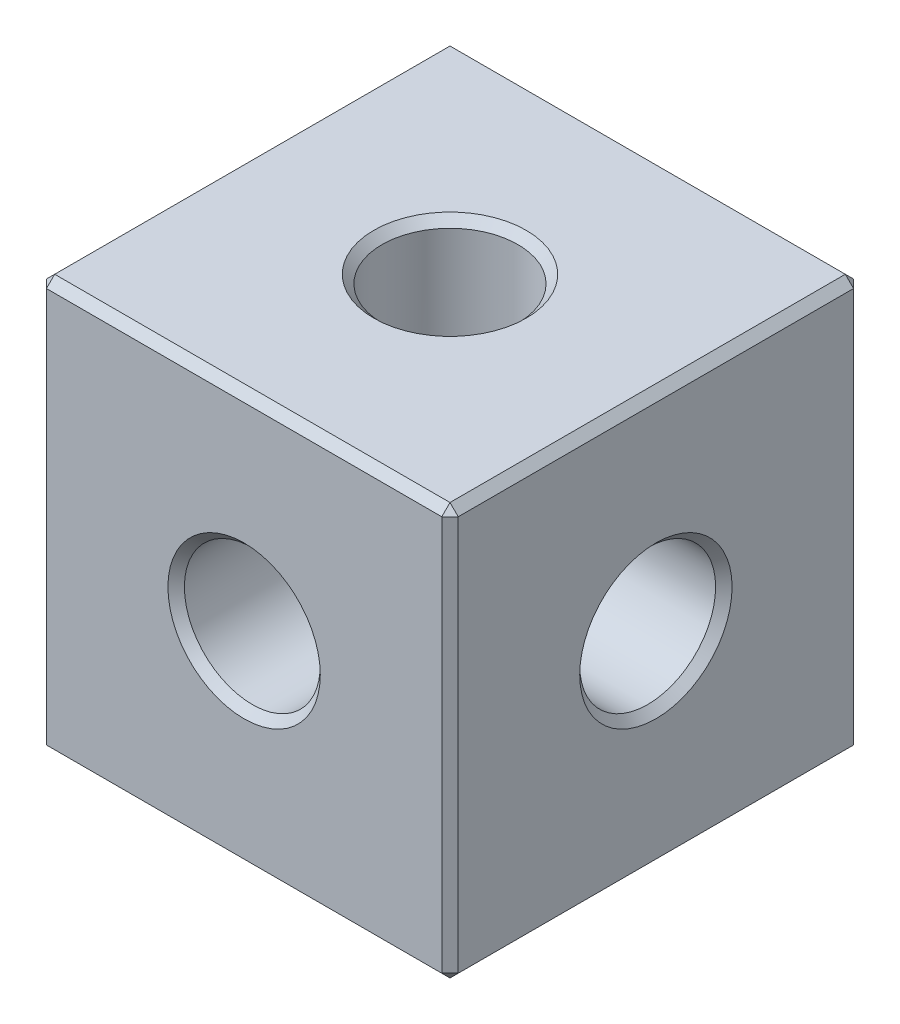
ISO-10303-21;
HEADER;
FILE_DESCRIPTION(('STEP AP214'),'2;1');
FILE_NAME('part.step','',(''),(''),'','','');
FILE_SCHEMA(('AUTOMOTIVE_DESIGN { 1 0 10303 214 1 1 1 1 }'));
ENDSEC;
DATA;
#1=APPLICATION_CONTEXT('core data for automotive mechanical design processes');
#2=APPLICATION_PROTOCOL_DEFINITION('international standard','automotive_design',2000,#1);
#3=PRODUCT_CONTEXT('',#1,'mechanical');
#4=PRODUCT('Part','Part','',(#3));
#5=PRODUCT_RELATED_PRODUCT_CATEGORY('part','',(#4));
#6=PRODUCT_DEFINITION_FORMATION('','',#4);
#7=PRODUCT_DEFINITION_CONTEXT('part definition',#1,'design');
#8=PRODUCT_DEFINITION('design','',#6,#7);
#9=PRODUCT_DEFINITION_SHAPE('','',#8);
#10=(LENGTH_UNIT() NAMED_UNIT(*) SI_UNIT(.MILLI.,.METRE.));
#11=(NAMED_UNIT(*) PLANE_ANGLE_UNIT() SI_UNIT($,.RADIAN.));
#12=(NAMED_UNIT(*) SI_UNIT($,.STERADIAN.) SOLID_ANGLE_UNIT());
#13=UNCERTAINTY_MEASURE_WITH_UNIT(LENGTH_MEASURE(1.E-05),#10,'distance_accuracy_value','');
#14=(GEOMETRIC_REPRESENTATION_CONTEXT(3) GLOBAL_UNCERTAINTY_ASSIGNED_CONTEXT((#13)) GLOBAL_UNIT_ASSIGNED_CONTEXT((#10,
#11,#12)) REPRESENTATION_CONTEXT('',''));
#15=CARTESIAN_POINT('',(0.,0.,0.));
#16=DIRECTION('',(0.,0.,1.));
#17=DIRECTION('',(1.,0.,0.));
#18=AXIS2_PLACEMENT_3D('',#15,#16,#17);
#19=CARTESIAN_POINT('',(0.,0.,5.));
#20=DIRECTION('',(0.,0.,1.));
#21=DIRECTION('',(1.,0.,0.));
#22=AXIS2_PLACEMENT_3D('',#19,#20,#21);
#23=CYLINDRICAL_SURFACE('',#22,1.65);
#24=CARTESIAN_POINT('',(0.,0.,4.8));
#25=DIRECTION('',(0.,0.,-1.));
#26=DIRECTION('',(-1.,0.,0.));
#27=AXIS2_PLACEMENT_3D('',#24,#25,#26);
#28=CIRCLE('',#27,1.65);
#29=CARTESIAN_POINT('',(-1.65,0.,4.8));
#30=VERTEX_POINT('',#29);
#31=EDGE_CURVE('E256',#30,#30,#28,.F.);
#32=ORIENTED_EDGE('',*,*,#31,.T.);
#33=EDGE_LOOP('',(#32));
#34=FACE_BOUND('',#33,.T.);
#35=CARTESIAN_POINT('',(0.,0.,0.));
#36=DIRECTION('',(0.,0.707106781186547,0.707106781186547));
#37=DIRECTION('',(0.,-0.707106781186547,0.707106781186547));
#38=AXIS2_PLACEMENT_3D('',#35,#36,#37);
#39=ELLIPSE('',#38,2.3334523779156,1.65);
#40=CARTESIAN_POINT('',(1.1667261889578,-1.1667261889578,1.1667261889578));
#41=VERTEX_POINT('',#40);
#42=CARTESIAN_POINT('',(-1.1667261889578,-1.1667261889578,1.1667261889578));
#43=VERTEX_POINT('',#42);
#44=EDGE_CURVE('E175',#41,#43,#39,.F.);
#45=ORIENTED_EDGE('',*,*,#44,.T.);
#46=CARTESIAN_POINT('',(0.,0.,0.));
#47=DIRECTION('',(0.707106781186548,0.,0.707106781186547));
#48=DIRECTION('',(-0.707106781186547,0.,0.707106781186547));
#49=AXIS2_PLACEMENT_3D('',#46,#47,#48);
#50=ELLIPSE('',#49,2.3334523779156,1.65);
#51=CARTESIAN_POINT('',(-1.1667261889578,1.1667261889578,1.1667261889578));
#52=VERTEX_POINT('',#51);
#53=EDGE_CURVE('E838',#43,#52,#50,.F.);
#54=ORIENTED_EDGE('',*,*,#53,.T.);
#55=CARTESIAN_POINT('',(0.,0.,0.));
#56=DIRECTION('',(0.,-0.707106781186547,0.707106781186547));
#57=DIRECTION('',(0.,0.707106781186547,0.707106781186547));
#58=AXIS2_PLACEMENT_3D('',#55,#56,#57);
#59=ELLIPSE('',#58,2.3334523779156,1.65);
#60=CARTESIAN_POINT('',(1.1667261889578,1.1667261889578,1.1667261889578));
#61=VERTEX_POINT('',#60);
#62=EDGE_CURVE('E191',#52,#61,#59,.F.);
#63=ORIENTED_EDGE('',*,*,#62,.T.);
#64=CARTESIAN_POINT('',(0.,0.,0.));
#65=DIRECTION('',(-0.707106781186547,0.,0.707106781186547));
#66=DIRECTION('',(0.707106781186548,0.,0.707106781186547));
#67=AXIS2_PLACEMENT_3D('',#64,#65,#66);
#68=ELLIPSE('',#67,2.3334523779156,1.65);
#69=EDGE_CURVE('E169',#61,#41,#68,.F.);
#70=ORIENTED_EDGE('',*,*,#69,.T.);
#71=EDGE_LOOP('',(#45,#54,#63,#70));
#72=FACE_BOUND('',#71,.T.);
#73=ADVANCED_FACE('F49',(#34,#72),#23,.F.);
#74=CARTESIAN_POINT('',(5.,5.,-5.));
#75=DIRECTION('',(-1.,0.,0.));
#76=DIRECTION('',(0.,0.,1.));
#77=AXIS2_PLACEMENT_3D('',#74,#75,#76);
#78=PLANE('',#77);
#79=CARTESIAN_POINT('',(5.,0.,0.));
#80=DIRECTION('',(-1.,0.,0.));
#81=DIRECTION('',(0.,0.,1.));
#82=AXIS2_PLACEMENT_3D('',#79,#80,#81);
#83=CIRCLE('',#82,1.84999999999999);
#84=CARTESIAN_POINT('',(5.,0.,1.84999999999999));
#85=VERTEX_POINT('',#84);
#86=EDGE_CURVE('E253',#85,#85,#83,.T.);
#87=ORIENTED_EDGE('',*,*,#86,.T.);
#88=EDGE_LOOP('',(#87));
#89=FACE_BOUND('',#88,.T.);
#90=DIRECTION('',(0.,0.,-1.));
#91=VECTOR('',#90,1.);
#92=CARTESIAN_POINT('',(5.,-4.8,-5.));
#93=LINE('',#92,#91);
#94=CARTESIAN_POINT('',(5.,-4.8,4.8));
#95=VERTEX_POINT('',#94);
#96=CARTESIAN_POINT('',(5.,-4.8,-4.8));
#97=VERTEX_POINT('',#96);
#98=EDGE_CURVE('E248',#95,#97,#93,.T.);
#99=ORIENTED_EDGE('',*,*,#98,.T.);
#100=DIRECTION('',(0.,1.,0.));
#101=VECTOR('',#100,1.);
#102=CARTESIAN_POINT('',(5.,5.,-4.8));
#103=LINE('',#102,#101);
#104=CARTESIAN_POINT('',(5.,4.8,-4.8));
#105=VERTEX_POINT('',#104);
#106=EDGE_CURVE('E250',#97,#105,#103,.T.);
#107=ORIENTED_EDGE('',*,*,#106,.T.);
#108=DIRECTION('',(0.,0.,1.));
#109=VECTOR('',#108,1.);
#110=CARTESIAN_POINT('',(5.,4.8,5.));
#111=LINE('',#110,#109);
#112=CARTESIAN_POINT('',(5.,4.8,4.8));
#113=VERTEX_POINT('',#112);
#114=EDGE_CURVE('E244',#105,#113,#111,.T.);
#115=ORIENTED_EDGE('',*,*,#114,.T.);
#116=DIRECTION('',(0.,-1.,0.));
#117=VECTOR('',#116,1.);
#118=CARTESIAN_POINT('',(5.,5.,4.8));
#119=LINE('',#118,#117);
#120=EDGE_CURVE('E246',#113,#95,#119,.T.);
#121=ORIENTED_EDGE('',*,*,#120,.T.);
#122=EDGE_LOOP('',(#99,#107,#115,#121));
#123=FACE_BOUND('',#122,.T.);
#124=ADVANCED_FACE('F357',(#89,#123),#78,.F.);
#125=CARTESIAN_POINT('',(-5.,5.,-5.));
#126=DIRECTION('',(0.,0.,1.));
#127=DIRECTION('',(1.,0.,0.));
#128=AXIS2_PLACEMENT_3D('',#125,#126,#127);
#129=PLANE('',#128);
#130=CARTESIAN_POINT('',(0.,0.,-5.));
#131=DIRECTION('',(0.,0.,1.));
#132=DIRECTION('',(1.,0.,0.));
#133=AXIS2_PLACEMENT_3D('',#130,#131,#132);
#134=CIRCLE('',#133,1.85);
#135=CARTESIAN_POINT('',(1.85,0.,-5.));
#136=VERTEX_POINT('',#135);
#137=EDGE_CURVE('E235',#136,#136,#134,.T.);
#138=ORIENTED_EDGE('',*,*,#137,.T.);
#139=EDGE_LOOP('',(#138));
#140=FACE_BOUND('',#139,.T.);
#141=DIRECTION('',(-1.,0.,0.));
#142=VECTOR('',#141,1.);
#143=CARTESIAN_POINT('',(-5.,-4.8,-5.));
#144=LINE('',#143,#142);
#145=CARTESIAN_POINT('',(4.8,-4.8,-5.));
#146=VERTEX_POINT('',#145);
#147=CARTESIAN_POINT('',(-4.8,-4.8,-5.));
#148=VERTEX_POINT('',#147);
#149=EDGE_CURVE('E230',#146,#148,#144,.T.);
#150=ORIENTED_EDGE('',*,*,#149,.T.);
#151=DIRECTION('',(0.,1.,0.));
#152=VECTOR('',#151,1.);
#153=CARTESIAN_POINT('',(-4.8,5.,-5.));
#154=LINE('',#153,#152);
#155=CARTESIAN_POINT('',(-4.8,4.8,-5.));
#156=VERTEX_POINT('',#155);
#157=EDGE_CURVE('E232',#148,#156,#154,.T.);
#158=ORIENTED_EDGE('',*,*,#157,.T.);
#159=DIRECTION('',(1.,0.,0.));
#160=VECTOR('',#159,1.);
#161=CARTESIAN_POINT('',(5.,4.8,-5.));
#162=LINE('',#161,#160);
#163=CARTESIAN_POINT('',(4.8,4.8,-5.));
#164=VERTEX_POINT('',#163);
#165=EDGE_CURVE('E226',#156,#164,#162,.T.);
#166=ORIENTED_EDGE('',*,*,#165,.T.);
#167=DIRECTION('',(0.,-1.,0.));
#168=VECTOR('',#167,1.);
#169=CARTESIAN_POINT('',(4.8,5.,-5.));
#170=LINE('',#169,#168);
#171=EDGE_CURVE('E228',#164,#146,#170,.T.);
#172=ORIENTED_EDGE('',*,*,#171,.T.);
#173=EDGE_LOOP('',(#150,#158,#166,#172));
#174=FACE_BOUND('',#173,.T.);
#175=ADVANCED_FACE('F378',(#140,#174),#129,.F.);
#176=CARTESIAN_POINT('',(-5.,5.,-5.));
#177=DIRECTION('',(1.,0.,0.));
#178=DIRECTION('',(0.,0.,-1.));
#179=AXIS2_PLACEMENT_3D('',#176,#177,#178);
#180=PLANE('',#179);
#181=CARTESIAN_POINT('',(-5.,0.,0.));
#182=DIRECTION('',(1.,0.,0.));
#183=DIRECTION('',(0.,0.,-1.));
#184=AXIS2_PLACEMENT_3D('',#181,#182,#183);
#185=CIRCLE('',#184,1.84999999999999);
#186=CARTESIAN_POINT('',(-5.,0.,-1.84999999999999));
#187=VERTEX_POINT('',#186);
#188=EDGE_CURVE('E220',#187,#187,#185,.T.);
#189=ORIENTED_EDGE('',*,*,#188,.T.);
#190=EDGE_LOOP('',(#189));
#191=FACE_BOUND('',#190,.T.);
#192=DIRECTION('',(0.,-1.,0.));
#193=VECTOR('',#192,1.);
#194=CARTESIAN_POINT('',(-5.,5.,-4.8));
#195=LINE('',#194,#193);
#196=CARTESIAN_POINT('',(-5.,4.8,-4.8));
#197=VERTEX_POINT('',#196);
#198=CARTESIAN_POINT('',(-5.,-4.8,-4.8));
#199=VERTEX_POINT('',#198);
#200=EDGE_CURVE('E215',#197,#199,#195,.T.);
#201=ORIENTED_EDGE('',*,*,#200,.T.);
#202=DIRECTION('',(0.,0.,1.));
#203=VECTOR('',#202,1.);
#204=CARTESIAN_POINT('',(-5.,-4.8,-5.));
#205=LINE('',#204,#203);
#206=CARTESIAN_POINT('',(-5.,-4.8,4.8));
#207=VERTEX_POINT('',#206);
#208=EDGE_CURVE('E217',#199,#207,#205,.T.);
#209=ORIENTED_EDGE('',*,*,#208,.T.);
#210=DIRECTION('',(0.,1.,0.));
#211=VECTOR('',#210,1.);
#212=CARTESIAN_POINT('',(-5.,5.,4.8));
#213=LINE('',#212,#211);
#214=CARTESIAN_POINT('',(-5.,4.8,4.8));
#215=VERTEX_POINT('',#214);
#216=EDGE_CURVE('E213',#207,#215,#213,.T.);
#217=ORIENTED_EDGE('',*,*,#216,.T.);
#218=DIRECTION('',(0.,0.,-1.));
#219=VECTOR('',#218,1.);
#220=CARTESIAN_POINT('',(-5.,4.8,-5.));
#221=LINE('',#220,#219);
#222=EDGE_CURVE('E211',#215,#197,#221,.T.);
#223=ORIENTED_EDGE('',*,*,#222,.T.);
#224=EDGE_LOOP('',(#201,#209,#217,#223));
#225=FACE_BOUND('',#224,.T.);
#226=ADVANCED_FACE('F439',(#191,#225),#180,.F.);
#227=CARTESIAN_POINT('',(-5.,5.,5.));
#228=DIRECTION('',(0.,0.,-1.));
#229=DIRECTION('',(-1.,0.,0.));
#230=AXIS2_PLACEMENT_3D('',#227,#228,#229);
#231=PLANE('',#230);
#232=CARTESIAN_POINT('',(0.,0.,5.));
#233=DIRECTION('',(0.,0.,-1.));
#234=DIRECTION('',(-1.,0.,0.));
#235=AXIS2_PLACEMENT_3D('',#232,#233,#234);
#236=CIRCLE('',#235,1.85);
#237=CARTESIAN_POINT('',(-1.85,0.,5.));
#238=VERTEX_POINT('',#237);
#239=EDGE_CURVE('E268',#238,#238,#236,.T.);
#240=ORIENTED_EDGE('',*,*,#239,.T.);
#241=EDGE_LOOP('',(#240));
#242=FACE_BOUND('',#241,.T.);
#243=DIRECTION('',(-1.,0.,0.));
#244=VECTOR('',#243,1.);
#245=CARTESIAN_POINT('',(-5.,4.8,5.));
#246=LINE('',#245,#244);
#247=CARTESIAN_POINT('',(4.8,4.8,5.));
#248=VERTEX_POINT('',#247);
#249=CARTESIAN_POINT('',(-4.8,4.8,5.));
#250=VERTEX_POINT('',#249);
#251=EDGE_CURVE('E259',#248,#250,#246,.T.);
#252=ORIENTED_EDGE('',*,*,#251,.T.);
#253=DIRECTION('',(0.,-1.,0.));
#254=VECTOR('',#253,1.);
#255=CARTESIAN_POINT('',(-4.8,5.,5.));
#256=LINE('',#255,#254);
#257=CARTESIAN_POINT('',(-4.8,-4.8,5.));
#258=VERTEX_POINT('',#257);
#259=EDGE_CURVE('E265',#250,#258,#256,.T.);
#260=ORIENTED_EDGE('',*,*,#259,.T.);
#261=DIRECTION('',(1.,0.,0.));
#262=VECTOR('',#261,1.);
#263=CARTESIAN_POINT('',(-5.,-4.8,5.));
#264=LINE('',#263,#262);
#265=CARTESIAN_POINT('',(4.8,-4.8,5.));
#266=VERTEX_POINT('',#265);
#267=EDGE_CURVE('E263',#258,#266,#264,.T.);
#268=ORIENTED_EDGE('',*,*,#267,.T.);
#269=DIRECTION('',(0.,1.,0.));
#270=VECTOR('',#269,1.);
#271=CARTESIAN_POINT('',(4.8,5.,5.));
#272=LINE('',#271,#270);
#273=EDGE_CURVE('E261',#266,#248,#272,.T.);
#274=ORIENTED_EDGE('',*,*,#273,.T.);
#275=EDGE_LOOP('',(#252,#260,#268,#274));
#276=FACE_BOUND('',#275,.T.);
#277=ADVANCED_FACE('F445',(#242,#276),#231,.F.);
#278=CARTESIAN_POINT('',(0.,5.,0.));
#279=DIRECTION('',(0.,1.,0.));
#280=DIRECTION('',(0.,0.,1.));
#281=AXIS2_PLACEMENT_3D('',#278,#279,#280);
#282=PLANE('',#281);
#283=DIRECTION('',(0.,0.,1.));
#284=VECTOR('',#283,1.);
#285=CARTESIAN_POINT('',(-4.8,5.,5.));
#286=LINE('',#285,#284);
#287=CARTESIAN_POINT('',(-4.80000000000001,5.,-4.8));
#288=VERTEX_POINT('',#287);
#289=CARTESIAN_POINT('',(-4.8,5.,4.8));
#290=VERTEX_POINT('',#289);
#291=EDGE_CURVE('E67',#288,#290,#286,.T.);
#292=ORIENTED_EDGE('',*,*,#291,.T.);
#293=DIRECTION('',(1.,0.,0.));
#294=VECTOR('',#293,1.);
#295=CARTESIAN_POINT('',(5.,5.,4.8));
#296=LINE('',#295,#294);
#297=CARTESIAN_POINT('',(4.8,5.,4.8));
#298=VERTEX_POINT('',#297);
#299=EDGE_CURVE('E59',#290,#298,#296,.T.);
#300=ORIENTED_EDGE('',*,*,#299,.T.);
#301=DIRECTION('',(0.,0.,-1.));
#302=VECTOR('',#301,1.);
#303=CARTESIAN_POINT('',(4.8,5.,-5.));
#304=LINE('',#303,#302);
#305=CARTESIAN_POINT('',(4.8,5.,-4.8));
#306=VERTEX_POINT('',#305);
#307=EDGE_CURVE('E274',#298,#306,#304,.T.);
#308=ORIENTED_EDGE('',*,*,#307,.T.);
#309=DIRECTION('',(-1.,0.,0.));
#310=VECTOR('',#309,1.);
#311=CARTESIAN_POINT('',(-5.,5.,-4.8));
#312=LINE('',#311,#310);
#313=EDGE_CURVE('E72',#306,#288,#312,.T.);
#314=ORIENTED_EDGE('',*,*,#313,.T.);
#315=EDGE_LOOP('',(#292,#300,#308,#314));
#316=FACE_BOUND('',#315,.T.);
#317=CARTESIAN_POINT('',(0.,5.,0.));
#318=DIRECTION('',(0.,1.,0.));
#319=DIRECTION('',(0.,0.,1.));
#320=AXIS2_PLACEMENT_3D('',#317,#318,#319);
#321=CIRCLE('',#320,1.85);
#322=CARTESIAN_POINT('',(0.,5.,1.85));
#323=VERTEX_POINT('',#322);
#324=EDGE_CURVE('E271',#323,#323,#321,.F.);
#325=ORIENTED_EDGE('',*,*,#324,.T.);
#326=EDGE_LOOP('',(#325));
#327=FACE_BOUND('',#326,.T.);
#328=ADVANCED_FACE('F425',(#316,#327),#282,.T.);
#329=CARTESIAN_POINT('',(0.,-5.,0.));
#330=DIRECTION('',(0.,1.,0.));
#331=DIRECTION('',(0.,0.,1.));
#332=AXIS2_PLACEMENT_3D('',#329,#330,#331);
#333=PLANE('',#332);
#334=CARTESIAN_POINT('',(0.,-5.,0.));
#335=DIRECTION('',(0.,1.,0.));
#336=DIRECTION('',(0.,0.,1.));
#337=AXIS2_PLACEMENT_3D('',#334,#335,#336);
#338=CIRCLE('',#337,1.85);
#339=CARTESIAN_POINT('',(0.,-5.,1.85));
#340=VERTEX_POINT('',#339);
#341=EDGE_CURVE('E205',#340,#340,#338,.T.);
#342=ORIENTED_EDGE('',*,*,#341,.T.);
#343=EDGE_LOOP('',(#342));
#344=FACE_BOUND('',#343,.T.);
#345=DIRECTION('',(-1.,0.,0.));
#346=VECTOR('',#345,1.);
#347=CARTESIAN_POINT('',(0.,-5.,4.8));
#348=LINE('',#347,#346);
#349=CARTESIAN_POINT('',(4.8,-5.,4.8));
#350=VERTEX_POINT('',#349);
#351=CARTESIAN_POINT('',(-4.8,-5.,4.8));
#352=VERTEX_POINT('',#351);
#353=EDGE_CURVE('E196',#350,#352,#348,.T.);
#354=ORIENTED_EDGE('',*,*,#353,.T.);
#355=DIRECTION('',(0.,0.,-1.));
#356=VECTOR('',#355,1.);
#357=CARTESIAN_POINT('',(-4.8,-5.,0.));
#358=LINE('',#357,#356);
#359=CARTESIAN_POINT('',(-4.80000000000001,-5.,-4.8));
#360=VERTEX_POINT('',#359);
#361=EDGE_CURVE('E202',#352,#360,#358,.T.);
#362=ORIENTED_EDGE('',*,*,#361,.T.);
#363=DIRECTION('',(1.,0.,0.));
#364=VECTOR('',#363,1.);
#365=CARTESIAN_POINT('',(0.,-5.,-4.8));
#366=LINE('',#365,#364);
#367=CARTESIAN_POINT('',(4.8,-5.,-4.8));
#368=VERTEX_POINT('',#367);
#369=EDGE_CURVE('E200',#360,#368,#366,.T.);
#370=ORIENTED_EDGE('',*,*,#369,.T.);
#371=DIRECTION('',(0.,0.,1.));
#372=VECTOR('',#371,1.);
#373=CARTESIAN_POINT('',(4.8,-5.,0.));
#374=LINE('',#373,#372);
#375=EDGE_CURVE('E198',#368,#350,#374,.T.);
#376=ORIENTED_EDGE('',*,*,#375,.T.);
#377=EDGE_LOOP('',(#354,#362,#370,#376));
#378=FACE_BOUND('',#377,.T.);
#379=ADVANCED_FACE('F417',(#344,#378),#333,.F.);
#380=CARTESIAN_POINT('',(0.,0.,-4.8));
#381=DIRECTION('',(0.,0.,1.));
#382=DIRECTION('',(1.,0.,0.));
#383=AXIS2_PLACEMENT_3D('',#380,#381,#382);
#384=CIRCLE('',#383,1.65);
#385=CARTESIAN_POINT('',(1.65,0.,-4.8));
#386=VERTEX_POINT('',#385);
#387=EDGE_CURVE('E238',#386,#386,#384,.F.);
#388=ORIENTED_EDGE('',*,*,#387,.T.);
#389=EDGE_LOOP('',(#388));
#390=FACE_BOUND('',#389,.T.);
#391=CARTESIAN_POINT('',(0.,0.,0.));
#392=DIRECTION('',(0.,-0.707106781186547,0.707106781186547));
#393=DIRECTION('',(0.,0.707106781186547,0.707106781186547));
#394=AXIS2_PLACEMENT_3D('',#391,#392,#393);
#395=ELLIPSE('',#394,2.3334523779156,1.65);
#396=CARTESIAN_POINT('',(-1.1667261889578,-1.1667261889578,-1.1667261889578));
#397=VERTEX_POINT('',#396);
#398=CARTESIAN_POINT('',(1.1667261889578,-1.1667261889578,-1.1667261889578));
#399=VERTEX_POINT('',#398);
#400=EDGE_CURVE('E184',#397,#399,#395,.T.);
#401=ORIENTED_EDGE('',*,*,#400,.T.);
#402=CARTESIAN_POINT('',(0.,0.,0.));
#403=DIRECTION('',(0.707106781186548,0.,0.707106781186547));
#404=DIRECTION('',(-0.707106781186547,0.,0.707106781186547));
#405=AXIS2_PLACEMENT_3D('',#402,#403,#404);
#406=ELLIPSE('',#405,2.3334523779156,1.65);
#407=CARTESIAN_POINT('',(1.1667261889578,1.1667261889578,-1.1667261889578));
#408=VERTEX_POINT('',#407);
#409=EDGE_CURVE('E166',#399,#408,#406,.T.);
#410=ORIENTED_EDGE('',*,*,#409,.T.);
#411=CARTESIAN_POINT('',(0.,0.,0.));
#412=DIRECTION('',(0.,0.707106781186547,0.707106781186547));
#413=DIRECTION('',(0.,-0.707106781186547,0.707106781186547));
#414=AXIS2_PLACEMENT_3D('',#411,#412,#413);
#415=ELLIPSE('',#414,2.3334523779156,1.65);
#416=CARTESIAN_POINT('',(-1.1667261889578,1.1667261889578,-1.1667261889578));
#417=VERTEX_POINT('',#416);
#418=EDGE_CURVE('E182',#408,#417,#415,.T.);
#419=ORIENTED_EDGE('',*,*,#418,.T.);
#420=CARTESIAN_POINT('',(0.,0.,0.));
#421=DIRECTION('',(-0.707106781186547,0.,0.707106781186547));
#422=DIRECTION('',(0.707106781186548,0.,0.707106781186547));
#423=AXIS2_PLACEMENT_3D('',#420,#421,#422);
#424=ELLIPSE('',#423,2.3334523779156,1.65);
#425=EDGE_CURVE('E836',#417,#397,#424,.T.);
#426=ORIENTED_EDGE('',*,*,#425,.T.);
#427=EDGE_LOOP('',(#401,#410,#419,#426));
#428=FACE_BOUND('',#427,.T.);
#429=ADVANCED_FACE('F180',(#390,#428),#23,.F.);
#430=CARTESIAN_POINT('',(0.,5.,0.));
#431=DIRECTION('',(0.,1.,0.));
#432=DIRECTION('',(0.,0.,1.));
#433=AXIS2_PLACEMENT_3D('',#430,#431,#432);
#434=CYLINDRICAL_SURFACE('',#433,1.65);
#435=CARTESIAN_POINT('',(0.,4.8,0.));
#436=DIRECTION('',(0.,1.,0.));
#437=DIRECTION('',(0.,0.,1.));
#438=AXIS2_PLACEMENT_3D('',#435,#436,#437);
#439=CIRCLE('',#438,1.65);
#440=CARTESIAN_POINT('',(0.,4.8,1.65));
#441=VERTEX_POINT('',#440);
#442=EDGE_CURVE('E11',#441,#441,#439,.T.);
#443=ORIENTED_EDGE('',*,*,#442,.T.);
#444=EDGE_LOOP('',(#443));
#445=FACE_BOUND('',#444,.T.);
#446=ORIENTED_EDGE('',*,*,#62,.F.);
#447=CARTESIAN_POINT('',(0.,0.,0.));
#448=DIRECTION('',(0.707106781186547,0.707106781186547,0.));
#449=DIRECTION('',(-0.707106781186547,0.707106781186547,0.));
#450=AXIS2_PLACEMENT_3D('',#447,#448,#449);
#451=ELLIPSE('',#450,2.3334523779156,1.65);
#452=EDGE_CURVE('E174',#52,#417,#451,.F.);
#453=ORIENTED_EDGE('',*,*,#452,.T.);
#454=ORIENTED_EDGE('',*,*,#418,.F.);
#455=CARTESIAN_POINT('',(0.,0.,0.));
#456=DIRECTION('',(-0.707106781186547,0.707106781186547,0.));
#457=DIRECTION('',(0.707106781186547,0.707106781186547,0.));
#458=AXIS2_PLACEMENT_3D('',#455,#456,#457);
#459=ELLIPSE('',#458,2.3334523779156,1.65);
#460=EDGE_CURVE('E163',#408,#61,#459,.F.);
#461=ORIENTED_EDGE('',*,*,#460,.T.);
#462=EDGE_LOOP('',(#446,#453,#454,#461));
#463=FACE_BOUND('',#462,.T.);
#464=ADVANCED_FACE('F187',(#445,#463),#434,.F.);
#465=CARTESIAN_POINT('',(0.,-4.8,0.));
#466=DIRECTION('',(0.,1.,0.));
#467=DIRECTION('',(0.,0.,1.));
#468=AXIS2_PLACEMENT_3D('',#465,#466,#467);
#469=CIRCLE('',#468,1.65);
#470=CARTESIAN_POINT('',(0.,-4.8,1.65));
#471=VERTEX_POINT('',#470);
#472=EDGE_CURVE('E208',#471,#471,#469,.F.);
#473=ORIENTED_EDGE('',*,*,#472,.T.);
#474=EDGE_LOOP('',(#473));
#475=FACE_BOUND('',#474,.T.);
#476=ORIENTED_EDGE('',*,*,#44,.F.);
#477=CARTESIAN_POINT('',(0.,0.,0.));
#478=DIRECTION('',(0.707106781186547,0.707106781186547,0.));
#479=DIRECTION('',(-0.707106781186547,0.707106781186547,0.));
#480=AXIS2_PLACEMENT_3D('',#477,#478,#479);
#481=ELLIPSE('',#480,2.3334523779156,1.65);
#482=EDGE_CURVE('E841',#41,#399,#481,.T.);
#483=ORIENTED_EDGE('',*,*,#482,.T.);
#484=ORIENTED_EDGE('',*,*,#400,.F.);
#485=CARTESIAN_POINT('',(0.,0.,0.));
#486=DIRECTION('',(-0.707106781186547,0.707106781186547,0.));
#487=DIRECTION('',(0.707106781186547,0.707106781186547,0.));
#488=AXIS2_PLACEMENT_3D('',#485,#486,#487);
#489=ELLIPSE('',#488,2.3334523779156,1.65);
#490=EDGE_CURVE('E835',#397,#43,#489,.T.);
#491=ORIENTED_EDGE('',*,*,#490,.T.);
#492=EDGE_LOOP('',(#476,#483,#484,#491));
#493=FACE_BOUND('',#492,.T.);
#494=ADVANCED_FACE('F422',(#475,#493),#434,.F.);
#495=CARTESIAN_POINT('',(5.,0.,0.));
#496=DIRECTION('',(1.,0.,0.));
#497=DIRECTION('',(0.,0.,-1.));
#498=AXIS2_PLACEMENT_3D('',#495,#496,#497);
#499=CYLINDRICAL_SURFACE('',#498,1.65);
#500=CARTESIAN_POINT('',(4.8,0.,0.));
#501=DIRECTION('',(-1.,0.,0.));
#502=DIRECTION('',(0.,0.,1.));
#503=AXIS2_PLACEMENT_3D('',#500,#501,#502);
#504=CIRCLE('',#503,1.65);
#505=CARTESIAN_POINT('',(4.8,0.,1.65));
#506=VERTEX_POINT('',#505);
#507=EDGE_CURVE('E241',#506,#506,#504,.F.);
#508=ORIENTED_EDGE('',*,*,#507,.T.);
#509=EDGE_LOOP('',(#508));
#510=FACE_BOUND('',#509,.T.);
#511=ORIENTED_EDGE('',*,*,#69,.F.);
#512=ORIENTED_EDGE('',*,*,#460,.F.);
#513=ORIENTED_EDGE('',*,*,#409,.F.);
#514=ORIENTED_EDGE('',*,*,#482,.F.);
#515=EDGE_LOOP('',(#511,#512,#513,#514));
#516=FACE_BOUND('',#515,.T.);
#517=ADVANCED_FACE('F165',(#510,#516),#499,.F.);
#518=CARTESIAN_POINT('',(-4.80000000000001,0.,0.));
#519=DIRECTION('',(1.,0.,0.));
#520=DIRECTION('',(0.,0.,-1.));
#521=AXIS2_PLACEMENT_3D('',#518,#519,#520);
#522=CIRCLE('',#521,1.65);
#523=CARTESIAN_POINT('',(-4.80000000000001,0.,-1.65));
#524=VERTEX_POINT('',#523);
#525=EDGE_CURVE('E223',#524,#524,#522,.F.);
#526=ORIENTED_EDGE('',*,*,#525,.T.);
#527=EDGE_LOOP('',(#526));
#528=FACE_BOUND('',#527,.T.);
#529=ORIENTED_EDGE('',*,*,#490,.F.);
#530=ORIENTED_EDGE('',*,*,#425,.F.);
#531=ORIENTED_EDGE('',*,*,#452,.F.);
#532=ORIENTED_EDGE('',*,*,#53,.F.);
#533=EDGE_LOOP('',(#529,#530,#531,#532));
#534=FACE_BOUND('',#533,.T.);
#535=ADVANCED_FACE('F457',(#528,#534),#499,.F.);
#536=CARTESIAN_POINT('',(0.,-5.,0.));
#537=DIRECTION('',(0.,-1.,0.));
#538=DIRECTION('',(0.,0.,-1.));
#539=AXIS2_PLACEMENT_3D('',#536,#537,#538);
#540=CONICAL_SURFACE('',#539,1.85,0.785398163397441);
#541=ORIENTED_EDGE('',*,*,#472,.F.);
#542=EDGE_LOOP('',(#541));
#543=FACE_BOUND('',#542,.T.);
#544=ORIENTED_EDGE('',*,*,#341,.F.);
#545=EDGE_LOOP('',(#544));
#546=FACE_BOUND('',#545,.T.);
#547=ADVANCED_FACE('F451',(#543,#546),#540,.F.);
#548=CARTESIAN_POINT('',(-5.,0.,0.));
#549=DIRECTION('',(-1.,0.,0.));
#550=DIRECTION('',(0.,0.,1.));
#551=AXIS2_PLACEMENT_3D('',#548,#549,#550);
#552=CONICAL_SURFACE('',#551,1.84999999999999,0.785398163397441);
#553=ORIENTED_EDGE('',*,*,#525,.F.);
#554=EDGE_LOOP('',(#553));
#555=FACE_BOUND('',#554,.T.);
#556=ORIENTED_EDGE('',*,*,#188,.F.);
#557=EDGE_LOOP('',(#556));
#558=FACE_BOUND('',#557,.T.);
#559=ADVANCED_FACE('F434',(#555,#558),#552,.F.);
#560=CARTESIAN_POINT('',(0.,0.,-5.));
#561=DIRECTION('',(0.,0.,-1.));
#562=DIRECTION('',(-1.,0.,0.));
#563=AXIS2_PLACEMENT_3D('',#560,#561,#562);
#564=CONICAL_SURFACE('',#563,1.85,0.785398163397441);
#565=ORIENTED_EDGE('',*,*,#387,.F.);
#566=EDGE_LOOP('',(#565));
#567=FACE_BOUND('',#566,.T.);
#568=ORIENTED_EDGE('',*,*,#137,.F.);
#569=EDGE_LOOP('',(#568));
#570=FACE_BOUND('',#569,.T.);
#571=ADVANCED_FACE('F430',(#567,#570),#564,.F.);
#572=CARTESIAN_POINT('',(4.8,0.,0.));
#573=DIRECTION('',(1.,0.,0.));
#574=DIRECTION('',(0.,0.,-1.));
#575=AXIS2_PLACEMENT_3D('',#572,#573,#574);
#576=CONICAL_SURFACE('',#575,1.65,0.785398163397446);
#577=ORIENTED_EDGE('',*,*,#86,.F.);
#578=EDGE_LOOP('',(#577));
#579=FACE_BOUND('',#578,.T.);
#580=ORIENTED_EDGE('',*,*,#507,.F.);
#581=EDGE_LOOP('',(#580));
#582=FACE_BOUND('',#581,.T.);
#583=ADVANCED_FACE('F433',(#579,#582),#576,.F.);
#584=CARTESIAN_POINT('',(0.,0.,4.8));
#585=DIRECTION('',(0.,0.,1.));
#586=DIRECTION('',(1.,0.,0.));
#587=AXIS2_PLACEMENT_3D('',#584,#585,#586);
#588=CONICAL_SURFACE('',#587,1.65,0.785398163397456);
#589=ORIENTED_EDGE('',*,*,#239,.F.);
#590=EDGE_LOOP('',(#589));
#591=FACE_BOUND('',#590,.T.);
#592=ORIENTED_EDGE('',*,*,#31,.F.);
#593=EDGE_LOOP('',(#592));
#594=FACE_BOUND('',#593,.T.);
#595=ADVANCED_FACE('F473',(#591,#594),#588,.F.);
#596=CARTESIAN_POINT('',(4.8,5.,0.));
#597=DIRECTION('',(0.707106781186548,0.707106781186547,0.));
#598=DIRECTION('',(0.,0.,1.));
#599=AXIS2_PLACEMENT_3D('',#596,#597,#598);
#600=PLANE('',#599);
#601=DIRECTION('',(0.707106781186547,-0.707106781186548,0.));
#602=VECTOR('',#601,1.);
#603=CARTESIAN_POINT('',(5.,4.8,-4.8));
#604=LINE('',#603,#602);
#605=EDGE_CURVE('E54',#306,#105,#604,.T.);
#606=ORIENTED_EDGE('',*,*,#605,.F.);
#607=ORIENTED_EDGE('',*,*,#307,.F.);
#608=DIRECTION('',(-0.707106781186547,0.707106781186548,0.));
#609=VECTOR('',#608,1.);
#610=CARTESIAN_POINT('',(4.9,4.9,4.8));
#611=LINE('',#610,#609);
#612=EDGE_CURVE('E338',#113,#298,#611,.T.);
#613=ORIENTED_EDGE('',*,*,#612,.F.);
#614=ORIENTED_EDGE('',*,*,#114,.F.);
#615=EDGE_LOOP('',(#606,#607,#613,#614));
#616=FACE_BOUND('',#615,.T.);
#617=ADVANCED_FACE('F354',(#616),#600,.T.);
#618=CARTESIAN_POINT('',(5.,4.8,-4.8));
#619=DIRECTION('',(0.577350269189627,0.577350269189625,-0.577350269189625));
#620=DIRECTION('',(-0.707106781186546,0.,-0.707106781186549));
#621=AXIS2_PLACEMENT_3D('',#618,#619,#620);
#622=PLANE('',#621);
#623=DIRECTION('',(0.,0.707106781186547,0.707106781186547));
#624=VECTOR('',#623,1.);
#625=CARTESIAN_POINT('',(4.8,4.9,-4.9));
#626=LINE('',#625,#624);
#627=EDGE_CURVE('E334',#306,#164,#626,.F.);
#628=ORIENTED_EDGE('',*,*,#627,.F.);
#629=ORIENTED_EDGE('',*,*,#605,.T.);
#630=DIRECTION('',(0.707106781186546,0.,0.707106781186549));
#631=VECTOR('',#630,1.);
#632=CARTESIAN_POINT('',(5.,4.8,-4.8));
#633=LINE('',#632,#631);
#634=EDGE_CURVE('E337',#164,#105,#633,.T.);
#635=ORIENTED_EDGE('',*,*,#634,.F.);
#636=EDGE_LOOP('',(#628,#629,#635));
#637=FACE_BOUND('',#636,.T.);
#638=ADVANCED_FACE('F351',(#637),#622,.T.);
#639=CARTESIAN_POINT('',(4.8,4.8,5.));
#640=DIRECTION('',(0.577350269189627,0.577350269189625,0.577350269189625));
#641=DIRECTION('',(0.707106781186546,0.,-0.707106781186549));
#642=AXIS2_PLACEMENT_3D('',#639,#640,#641);
#643=PLANE('',#642);
#644=DIRECTION('',(-0.707106781186546,0.,0.707106781186549));
#645=VECTOR('',#644,1.);
#646=CARTESIAN_POINT('',(4.8,4.8,5.));
#647=LINE('',#646,#645);
#648=EDGE_CURVE('E329',#113,#248,#647,.T.);
#649=ORIENTED_EDGE('',*,*,#648,.F.);
#650=ORIENTED_EDGE('',*,*,#612,.T.);
#651=DIRECTION('',(0.,-0.707106781186547,0.707106781186547));
#652=VECTOR('',#651,1.);
#653=CARTESIAN_POINT('',(4.8,4.8,5.));
#654=LINE('',#653,#652);
#655=EDGE_CURVE('E332',#248,#298,#654,.F.);
#656=ORIENTED_EDGE('',*,*,#655,.F.);
#657=EDGE_LOOP('',(#649,#650,#656));
#658=FACE_BOUND('',#657,.T.);
#659=ADVANCED_FACE('F402',(#658),#643,.T.);
#660=CARTESIAN_POINT('',(4.8,5.,-5.));
#661=DIRECTION('',(-0.707106781186549,0.,0.707106781186546));
#662=DIRECTION('',(0.,-1.,0.));
#663=AXIS2_PLACEMENT_3D('',#660,#661,#662);
#664=PLANE('',#663);
#665=ORIENTED_EDGE('',*,*,#634,.T.);
#666=ORIENTED_EDGE('',*,*,#106,.F.);
#667=DIRECTION('',(-0.707106781186546,0.,-0.707106781186549));
#668=VECTOR('',#667,1.);
#669=CARTESIAN_POINT('',(4.9,-4.8,-4.9));
#670=LINE('',#669,#668);
#671=EDGE_CURVE('E323',#146,#97,#670,.F.);
#672=ORIENTED_EDGE('',*,*,#671,.F.);
#673=ORIENTED_EDGE('',*,*,#171,.F.);
#674=EDGE_LOOP('',(#665,#666,#672,#673));
#675=FACE_BOUND('',#674,.T.);
#676=ADVANCED_FACE('F362',(#675),#664,.F.);
#677=CARTESIAN_POINT('',(0.,5.,-4.8));
#678=DIRECTION('',(0.,0.707106781186548,-0.707106781186548));
#679=DIRECTION('',(1.,0.,0.));
#680=AXIS2_PLACEMENT_3D('',#677,#678,#679);
#681=PLANE('',#680);
#682=ORIENTED_EDGE('',*,*,#627,.T.);
#683=ORIENTED_EDGE('',*,*,#165,.F.);
#684=DIRECTION('',(0.,-0.707106781186547,-0.707106781186547));
#685=VECTOR('',#684,1.);
#686=CARTESIAN_POINT('',(-4.8,4.8,-5.));
#687=LINE('',#686,#685);
#688=EDGE_CURVE('E320',#288,#156,#687,.T.);
#689=ORIENTED_EDGE('',*,*,#688,.F.);
#690=ORIENTED_EDGE('',*,*,#313,.F.);
#691=EDGE_LOOP('',(#682,#683,#689,#690));
#692=FACE_BOUND('',#691,.T.);
#693=ADVANCED_FACE('F391',(#692),#681,.T.);
#694=CARTESIAN_POINT('',(-4.8,5.,0.));
#695=DIRECTION('',(-0.707106781186548,0.707106781186547,0.));
#696=DIRECTION('',(0.,0.,-1.));
#697=AXIS2_PLACEMENT_3D('',#694,#695,#696);
#698=PLANE('',#697);
#699=DIRECTION('',(-0.707106781186547,-0.707106781186548,0.));
#700=VECTOR('',#699,1.);
#701=CARTESIAN_POINT('',(-5.,4.8,4.8));
#702=LINE('',#701,#700);
#703=EDGE_CURVE('E314',#290,#215,#702,.T.);
#704=ORIENTED_EDGE('',*,*,#703,.F.);
#705=ORIENTED_EDGE('',*,*,#291,.F.);
#706=DIRECTION('',(0.707106781186547,0.707106781186548,0.));
#707=VECTOR('',#706,1.);
#708=CARTESIAN_POINT('',(-4.9,4.9,-4.8));
#709=LINE('',#708,#707);
#710=EDGE_CURVE('E317',#197,#288,#709,.T.);
#711=ORIENTED_EDGE('',*,*,#710,.F.);
#712=ORIENTED_EDGE('',*,*,#222,.F.);
#713=EDGE_LOOP('',(#704,#705,#711,#712));
#714=FACE_BOUND('',#713,.T.);
#715=ADVANCED_FACE('F393',(#714),#698,.T.);
#716=CARTESIAN_POINT('',(0.,5.,4.8));
#717=DIRECTION('',(0.,0.707106781186548,0.707106781186548));
#718=DIRECTION('',(-1.,0.,0.));
#719=AXIS2_PLACEMENT_3D('',#716,#717,#718);
#720=PLANE('',#719);
#721=ORIENTED_EDGE('',*,*,#655,.T.);
#722=ORIENTED_EDGE('',*,*,#299,.F.);
#723=DIRECTION('',(0.,0.707106781186547,-0.707106781186547));
#724=VECTOR('',#723,1.);
#725=CARTESIAN_POINT('',(-4.8,4.9,4.9));
#726=LINE('',#725,#724);
#727=EDGE_CURVE('E311',#250,#290,#726,.T.);
#728=ORIENTED_EDGE('',*,*,#727,.F.);
#729=ORIENTED_EDGE('',*,*,#251,.F.);
#730=EDGE_LOOP('',(#721,#722,#728,#729));
#731=FACE_BOUND('',#730,.T.);
#732=ADVANCED_FACE('F399',(#731),#720,.T.);
#733=CARTESIAN_POINT('',(5.,5.,4.8));
#734=DIRECTION('',(-0.707106781186549,0.,-0.707106781186546));
#735=DIRECTION('',(0.,-1.,0.));
#736=AXIS2_PLACEMENT_3D('',#733,#734,#735);
#737=PLANE('',#736);
#738=ORIENTED_EDGE('',*,*,#648,.T.);
#739=ORIENTED_EDGE('',*,*,#273,.F.);
#740=DIRECTION('',(0.707106781186546,0.,-0.707106781186549));
#741=VECTOR('',#740,1.);
#742=CARTESIAN_POINT('',(4.9,-4.8,4.9));
#743=LINE('',#742,#741);
#744=EDGE_CURVE('E308',#95,#266,#743,.F.);
#745=ORIENTED_EDGE('',*,*,#744,.F.);
#746=ORIENTED_EDGE('',*,*,#120,.F.);
#747=EDGE_LOOP('',(#738,#739,#745,#746));
#748=FACE_BOUND('',#747,.T.);
#749=ADVANCED_FACE('F556',(#748),#737,.F.);
#750=CARTESIAN_POINT('',(5.,-4.8,-5.));
#751=DIRECTION('',(-0.707106781186548,0.707106781186547,0.));
#752=DIRECTION('',(0.,0.,-1.));
#753=AXIS2_PLACEMENT_3D('',#750,#751,#752);
#754=PLANE('',#753);
#755=DIRECTION('',(0.707106781186547,0.707106781186548,0.));
#756=VECTOR('',#755,1.);
#757=CARTESIAN_POINT('',(4.8,-5.,-4.8));
#758=LINE('',#757,#756);
#759=EDGE_CURVE('E326',#97,#368,#758,.F.);
#760=ORIENTED_EDGE('',*,*,#759,.F.);
#761=ORIENTED_EDGE('',*,*,#98,.F.);
#762=DIRECTION('',(-0.707106781186547,-0.707106781186548,0.));
#763=VECTOR('',#762,1.);
#764=CARTESIAN_POINT('',(4.8,-5.,4.8));
#765=LINE('',#764,#763);
#766=EDGE_CURVE('E305',#350,#95,#765,.F.);
#767=ORIENTED_EDGE('',*,*,#766,.F.);
#768=ORIENTED_EDGE('',*,*,#375,.F.);
#769=EDGE_LOOP('',(#760,#761,#767,#768));
#770=FACE_BOUND('',#769,.T.);
#771=ADVANCED_FACE('F366',(#770),#754,.F.);
#772=CARTESIAN_POINT('',(4.8,-5.,-4.8));
#773=DIRECTION('',(0.577350269189627,-0.577350269189625,-0.577350269189625));
#774=DIRECTION('',(-0.707106781186546,0.,-0.707106781186549));
#775=AXIS2_PLACEMENT_3D('',#772,#773,#774);
#776=PLANE('',#775);
#777=ORIENTED_EDGE('',*,*,#671,.T.);
#778=ORIENTED_EDGE('',*,*,#759,.T.);
#779=DIRECTION('',(0.,-0.707106781186547,0.707106781186547));
#780=VECTOR('',#779,1.);
#781=CARTESIAN_POINT('',(4.8,-5.,-4.8));
#782=LINE('',#781,#780);
#783=EDGE_CURVE('E302',#146,#368,#782,.T.);
#784=ORIENTED_EDGE('',*,*,#783,.F.);
#785=EDGE_LOOP('',(#777,#778,#784));
#786=FACE_BOUND('',#785,.T.);
#787=ADVANCED_FACE('F370',(#786),#776,.T.);
#788=CARTESIAN_POINT('',(-4.8,4.8,-5.));
#789=DIRECTION('',(-0.577350269189627,0.577350269189624,-0.577350269189627));
#790=DIRECTION('',(-0.707106781186547,0.,0.707106781186547));
#791=AXIS2_PLACEMENT_3D('',#788,#789,#790);
#792=PLANE('',#791);
#793=ORIENTED_EDGE('',*,*,#710,.T.);
#794=ORIENTED_EDGE('',*,*,#688,.T.);
#795=DIRECTION('',(0.707106781186548,0.,-0.707106781186548));
#796=VECTOR('',#795,1.);
#797=CARTESIAN_POINT('',(-4.8,4.8,-5.));
#798=LINE('',#797,#796);
#799=EDGE_CURVE('E300',#197,#156,#798,.T.);
#800=ORIENTED_EDGE('',*,*,#799,.F.);
#801=EDGE_LOOP('',(#793,#794,#800));
#802=FACE_BOUND('',#801,.T.);
#803=ADVANCED_FACE('F388',(#802),#792,.T.);
#804=CARTESIAN_POINT('',(-5.,4.8,4.8));
#805=DIRECTION('',(-0.577350269189627,0.577350269189624,0.577350269189627));
#806=DIRECTION('',(0.707106781186547,0.,0.707106781186547));
#807=AXIS2_PLACEMENT_3D('',#804,#805,#806);
#808=PLANE('',#807);
#809=ORIENTED_EDGE('',*,*,#727,.T.);
#810=ORIENTED_EDGE('',*,*,#703,.T.);
#811=DIRECTION('',(-0.707106781186548,0.,-0.707106781186548));
#812=VECTOR('',#811,1.);
#813=CARTESIAN_POINT('',(-5.,4.8,4.8));
#814=LINE('',#813,#812);
#815=EDGE_CURVE('E297',#250,#215,#814,.T.);
#816=ORIENTED_EDGE('',*,*,#815,.F.);
#817=EDGE_LOOP('',(#809,#810,#816));
#818=FACE_BOUND('',#817,.T.);
#819=ADVANCED_FACE('F533',(#818),#808,.T.);
#820=CARTESIAN_POINT('',(4.8,-5.,4.8));
#821=DIRECTION('',(0.577350269189627,-0.577350269189625,0.577350269189625));
#822=DIRECTION('',(0.707106781186546,0.,-0.707106781186549));
#823=AXIS2_PLACEMENT_3D('',#820,#821,#822);
#824=PLANE('',#823);
#825=ORIENTED_EDGE('',*,*,#766,.T.);
#826=ORIENTED_EDGE('',*,*,#744,.T.);
#827=DIRECTION('',(0.,0.707106781186547,0.707106781186547));
#828=VECTOR('',#827,1.);
#829=CARTESIAN_POINT('',(4.8,-5.,4.8));
#830=LINE('',#829,#828);
#831=EDGE_CURVE('E294',#350,#266,#830,.T.);
#832=ORIENTED_EDGE('',*,*,#831,.F.);
#833=EDGE_LOOP('',(#825,#826,#832));
#834=FACE_BOUND('',#833,.T.);
#835=ADVANCED_FACE('F527',(#834),#824,.T.);
#836=CARTESIAN_POINT('',(-5.,-4.8,-5.));
#837=DIRECTION('',(0.,0.707106781186548,0.707106781186548));
#838=DIRECTION('',(-1.,0.,0.));
#839=AXIS2_PLACEMENT_3D('',#836,#837,#838);
#840=PLANE('',#839);
#841=ORIENTED_EDGE('',*,*,#783,.T.);
#842=ORIENTED_EDGE('',*,*,#369,.F.);
#843=DIRECTION('',(0.,0.707106781186547,-0.707106781186547));
#844=VECTOR('',#843,1.);
#845=CARTESIAN_POINT('',(-4.80000000000001,-5.,-4.8));
#846=LINE('',#845,#844);
#847=EDGE_CURVE('E291',#148,#360,#846,.F.);
#848=ORIENTED_EDGE('',*,*,#847,.F.);
#849=ORIENTED_EDGE('',*,*,#149,.F.);
#850=EDGE_LOOP('',(#841,#842,#848,#849));
#851=FACE_BOUND('',#850,.T.);
#852=ADVANCED_FACE('F375',(#851),#840,.F.);
#853=CARTESIAN_POINT('',(-5.,5.,-4.8));
#854=DIRECTION('',(0.707106781186548,0.,0.707106781186548));
#855=DIRECTION('',(0.,-1.,0.));
#856=AXIS2_PLACEMENT_3D('',#853,#854,#855);
#857=PLANE('',#856);
#858=ORIENTED_EDGE('',*,*,#799,.T.);
#859=ORIENTED_EDGE('',*,*,#157,.F.);
#860=DIRECTION('',(-0.707106781186548,0.,0.707106781186548));
#861=VECTOR('',#860,1.);
#862=CARTESIAN_POINT('',(-4.9,-4.8,-4.9));
#863=LINE('',#862,#861);
#864=EDGE_CURVE('E288',#199,#148,#863,.F.);
#865=ORIENTED_EDGE('',*,*,#864,.F.);
#866=ORIENTED_EDGE('',*,*,#200,.F.);
#867=EDGE_LOOP('',(#858,#859,#865,#866));
#868=FACE_BOUND('',#867,.T.);
#869=ADVANCED_FACE('F381',(#868),#857,.F.);
#870=CARTESIAN_POINT('',(-4.8,5.,5.));
#871=DIRECTION('',(0.707106781186548,0.,-0.707106781186548));
#872=DIRECTION('',(0.,-1.,0.));
#873=AXIS2_PLACEMENT_3D('',#870,#871,#872);
#874=PLANE('',#873);
#875=ORIENTED_EDGE('',*,*,#815,.T.);
#876=ORIENTED_EDGE('',*,*,#216,.F.);
#877=DIRECTION('',(0.707106781186548,0.,0.707106781186548));
#878=VECTOR('',#877,1.);
#879=CARTESIAN_POINT('',(-5.,-4.8,4.8));
#880=LINE('',#879,#878);
#881=EDGE_CURVE('E285',#258,#207,#880,.F.);
#882=ORIENTED_EDGE('',*,*,#881,.F.);
#883=ORIENTED_EDGE('',*,*,#259,.F.);
#884=EDGE_LOOP('',(#875,#876,#882,#883));
#885=FACE_BOUND('',#884,.T.);
#886=ADVANCED_FACE('F509',(#885),#874,.F.);
#887=CARTESIAN_POINT('',(-5.,-4.8,5.));
#888=DIRECTION('',(0.,0.707106781186548,-0.707106781186548));
#889=DIRECTION('',(1.,0.,0.));
#890=AXIS2_PLACEMENT_3D('',#887,#888,#889);
#891=PLANE('',#890);
#892=ORIENTED_EDGE('',*,*,#831,.T.);
#893=ORIENTED_EDGE('',*,*,#267,.F.);
#894=DIRECTION('',(0.,-0.707106781186547,-0.707106781186547));
#895=VECTOR('',#894,1.);
#896=CARTESIAN_POINT('',(-4.8,-4.9,4.9));
#897=LINE('',#896,#895);
#898=EDGE_CURVE('E283',#352,#258,#897,.F.);
#899=ORIENTED_EDGE('',*,*,#898,.F.);
#900=ORIENTED_EDGE('',*,*,#353,.F.);
#901=EDGE_LOOP('',(#892,#893,#899,#900));
#902=FACE_BOUND('',#901,.T.);
#903=ADVANCED_FACE('F502',(#902),#891,.F.);
#904=CARTESIAN_POINT('',(-4.80000000000001,-5.,-4.8));
#905=DIRECTION('',(-0.577350269189627,-0.577350269189624,-0.577350269189627));
#906=DIRECTION('',(-0.707106781186547,0.,0.707106781186547));
#907=AXIS2_PLACEMENT_3D('',#904,#905,#906);
#908=PLANE('',#907);
#909=ORIENTED_EDGE('',*,*,#864,.T.);
#910=ORIENTED_EDGE('',*,*,#847,.T.);
#911=DIRECTION('',(0.707106781186547,-0.707106781186548,0.));
#912=VECTOR('',#911,1.);
#913=CARTESIAN_POINT('',(-4.80000000000001,-5.,-4.8));
#914=LINE('',#913,#912);
#915=EDGE_CURVE('E281',#199,#360,#914,.T.);
#916=ORIENTED_EDGE('',*,*,#915,.F.);
#917=EDGE_LOOP('',(#909,#910,#916));
#918=FACE_BOUND('',#917,.T.);
#919=ADVANCED_FACE('F495',(#918),#908,.T.);
#920=CARTESIAN_POINT('',(-5.,-4.8,4.8));
#921=DIRECTION('',(-0.577350269189627,-0.577350269189624,0.577350269189627));
#922=DIRECTION('',(0.707106781186547,0.,0.707106781186547));
#923=AXIS2_PLACEMENT_3D('',#920,#921,#922);
#924=PLANE('',#923);
#925=ORIENTED_EDGE('',*,*,#898,.T.);
#926=ORIENTED_EDGE('',*,*,#881,.T.);
#927=DIRECTION('',(-0.707106781186547,0.707106781186548,0.));
#928=VECTOR('',#927,1.);
#929=CARTESIAN_POINT('',(-5.,-4.8,4.8));
#930=LINE('',#929,#928);
#931=EDGE_CURVE('E279',#352,#207,#930,.T.);
#932=ORIENTED_EDGE('',*,*,#931,.F.);
#933=EDGE_LOOP('',(#925,#926,#932));
#934=FACE_BOUND('',#933,.T.);
#935=ADVANCED_FACE('F488',(#934),#924,.T.);
#936=CARTESIAN_POINT('',(-5.,-4.8,-5.));
#937=DIRECTION('',(0.707106781186548,0.707106781186547,0.));
#938=DIRECTION('',(0.,0.,1.));
#939=AXIS2_PLACEMENT_3D('',#936,#937,#938);
#940=PLANE('',#939);
#941=ORIENTED_EDGE('',*,*,#915,.T.);
#942=ORIENTED_EDGE('',*,*,#361,.F.);
#943=ORIENTED_EDGE('',*,*,#931,.T.);
#944=ORIENTED_EDGE('',*,*,#208,.F.);
#945=EDGE_LOOP('',(#941,#942,#943,#944));
#946=FACE_BOUND('',#945,.T.);
#947=ADVANCED_FACE('F482',(#946),#940,.F.);
#948=CARTESIAN_POINT('',(0.,4.8,0.));
#949=DIRECTION('',(0.,1.,0.));
#950=DIRECTION('',(0.,0.,1.));
#951=AXIS2_PLACEMENT_3D('',#948,#949,#950);
#952=CONICAL_SURFACE('',#951,1.65,0.785398163397456);
#953=ORIENTED_EDGE('',*,*,#324,.F.);
#954=EDGE_LOOP('',(#953));
#955=FACE_BOUND('',#954,.T.);
#956=ORIENTED_EDGE('',*,*,#442,.F.);
#957=EDGE_LOOP('',(#956));
#958=FACE_BOUND('',#957,.T.);
#959=ADVANCED_FACE('F52',(#955,#958),#952,.F.);
#960=CLOSED_SHELL('',(#73,#124,#175,#226,#277,#328,#379,#429,#464,#494,#517,#535,#547,#559,#571,
#583,#595,#617,#638,#659,#676,#693,#715,#732,#749,#771,#787,#803,#819,#835,#852,#869,#886,#903,
#919,#935,#947,#959));
#961=MANIFOLD_SOLID_BREP('B2',#960);
#962=ADVANCED_BREP_SHAPE_REPRESENTATION('',(#18,#961),#14);
#963=SHAPE_DEFINITION_REPRESENTATION(#9,#962);
ENDSEC;
END-ISO-10303-21;
